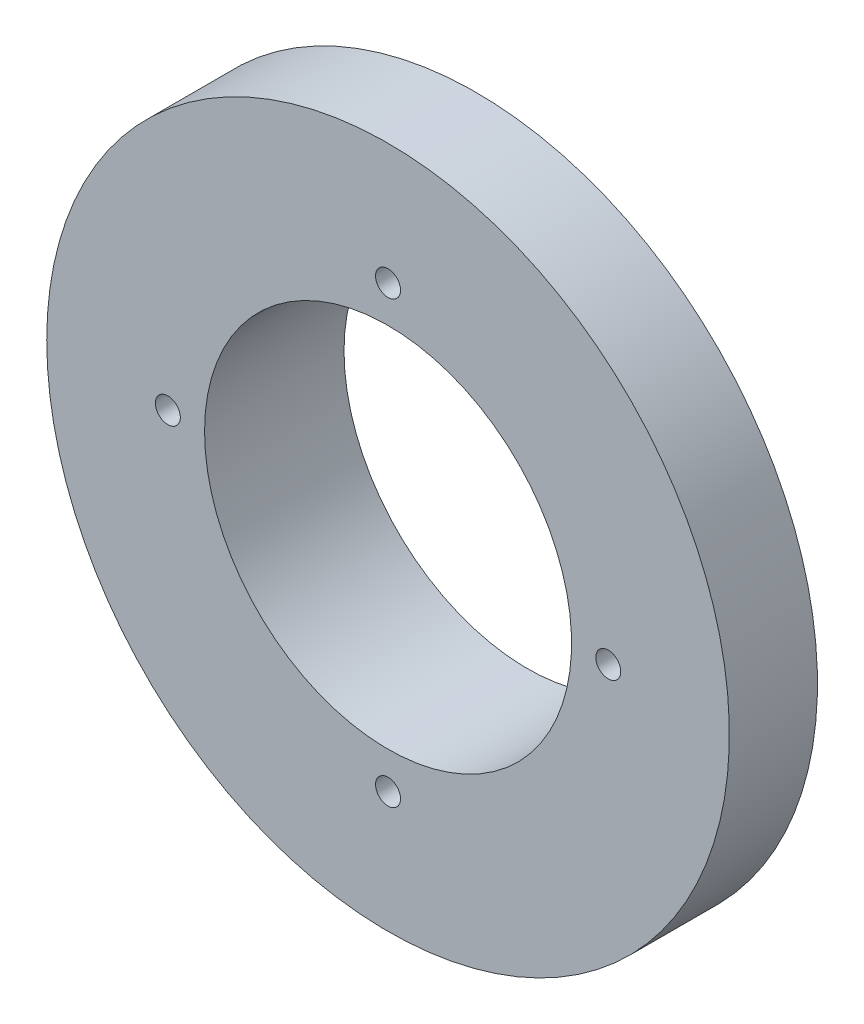
ISO-10303-21;
HEADER;
FILE_DESCRIPTION(('STEP AP214'),'2;1');
FILE_NAME('part.step','',(''),(''),'','','');
FILE_SCHEMA(('AUTOMOTIVE_DESIGN { 1 0 10303 214 1 1 1 1 }'));
ENDSEC;
DATA;
#1=APPLICATION_CONTEXT('core data for automotive mechanical design processes');
#2=APPLICATION_PROTOCOL_DEFINITION('international standard','automotive_design',2000,#1);
#3=PRODUCT_CONTEXT('',#1,'mechanical');
#4=PRODUCT('Part','Part','',(#3));
#5=PRODUCT_RELATED_PRODUCT_CATEGORY('part','',(#4));
#6=PRODUCT_DEFINITION_FORMATION('','',#4);
#7=PRODUCT_DEFINITION_CONTEXT('part definition',#1,'design');
#8=PRODUCT_DEFINITION('design','',#6,#7);
#9=PRODUCT_DEFINITION_SHAPE('','',#8);
#10=(LENGTH_UNIT() NAMED_UNIT(*) SI_UNIT(.MILLI.,.METRE.));
#11=(NAMED_UNIT(*) PLANE_ANGLE_UNIT() SI_UNIT($,.RADIAN.));
#12=(NAMED_UNIT(*) SI_UNIT($,.STERADIAN.) SOLID_ANGLE_UNIT());
#13=UNCERTAINTY_MEASURE_WITH_UNIT(LENGTH_MEASURE(1.E-05),#10,'distance_accuracy_value','');
#14=(GEOMETRIC_REPRESENTATION_CONTEXT(3) GLOBAL_UNCERTAINTY_ASSIGNED_CONTEXT((#13)) GLOBAL_UNIT_ASSIGNED_CONTEXT((#10,
#11,#12)) REPRESENTATION_CONTEXT('',''));
#15=CARTESIAN_POINT('',(0.,0.,0.));
#16=DIRECTION('',(0.,0.,1.));
#17=DIRECTION('',(1.,0.,0.));
#18=AXIS2_PLACEMENT_3D('',#15,#16,#17);
#19=CARTESIAN_POINT('',(46.5,8.32667268468867E-13,19.));
#20=DIRECTION('',(0.,0.,-0.999999999999998));
#21=DIRECTION('',(-0.999999999999999,0.,0.));
#22=AXIS2_PLACEMENT_3D('',#19,#20,#21);
#23=PLANE('',#22);
#24=CARTESIAN_POINT('',(30.,4.16333634234434E-13,19.0000000000001));
#25=DIRECTION('',(0.,0.,-0.999999999999998));
#26=DIRECTION('',(-0.999999999999999,0.,0.));
#27=AXIS2_PLACEMENT_3D('',#24,#25,#26);
#28=CIRCLE('',#27,1.7);
#29=CARTESIAN_POINT('',(31.7,1.97593805245993E-13,19.0000000000001));
#30=VERTEX_POINT('',#29);
#31=EDGE_CURVE('E78',#30,#30,#28,.T.);
#32=ORIENTED_EDGE('',*,*,#31,.T.);
#33=EDGE_LOOP('',(#32));
#34=FACE_BOUND('',#33,.T.);
#35=CARTESIAN_POINT('',(0.,-29.9999999999997,19.));
#36=DIRECTION('',(0.,0.,-0.999999999999998));
#37=DIRECTION('',(-0.999999999999999,0.,0.));
#38=AXIS2_PLACEMENT_3D('',#35,#36,#37);
#39=CIRCLE('',#38,1.7);
#40=CARTESIAN_POINT('',(1.7,-29.9999999999997,19.));
#41=VERTEX_POINT('',#40);
#42=EDGE_CURVE('E81',#41,#41,#39,.T.);
#43=ORIENTED_EDGE('',*,*,#42,.T.);
#44=EDGE_LOOP('',(#43));
#45=FACE_BOUND('',#44,.T.);
#46=CARTESIAN_POINT('',(-29.9999999999998,6.10622663543836E-13,19.0000000000003));
#47=DIRECTION('',(0.,0.,-0.999999999999998));
#48=DIRECTION('',(-0.999999999999999,0.,0.));
#49=AXIS2_PLACEMENT_3D('',#46,#47,#48);
#50=CIRCLE('',#49,1.7);
#51=CARTESIAN_POINT('',(-30.,-1.69999999999942,19.0000000000003));
#52=VERTEX_POINT('',#51);
#53=EDGE_CURVE('E85',#52,#52,#50,.T.);
#54=ORIENTED_EDGE('',*,*,#53,.T.);
#55=EDGE_LOOP('',(#54));
#56=FACE_BOUND('',#55,.T.);
#57=CARTESIAN_POINT('',(2.77555756156289E-13,30.0000000000002,19.0000000000003));
#58=DIRECTION('',(0.,0.,-0.999999999999998));
#59=DIRECTION('',(-0.999999999999999,0.,0.));
#60=AXIS2_PLACEMENT_3D('',#57,#58,#59);
#61=CIRCLE('',#60,1.7);
#62=CARTESIAN_POINT('',(1.70000000000028,30.,19.0000000000003));
#63=VERTEX_POINT('',#62);
#64=EDGE_CURVE('E70',#63,#63,#61,.T.);
#65=ORIENTED_EDGE('',*,*,#64,.T.);
#66=EDGE_LOOP('',(#65));
#67=FACE_BOUND('',#66,.T.);
#68=CARTESIAN_POINT('',(0.,3.05311331771918E-13,19.0000000000003));
#69=DIRECTION('',(0.,0.,-0.999999999999998));
#70=DIRECTION('',(-0.999999999999999,0.,0.));
#71=AXIS2_PLACEMENT_3D('',#68,#69,#70);
#72=CIRCLE('',#71,46.5);
#73=CARTESIAN_POINT('',(-46.5,2.04418216505986E-13,19.0000000000003));
#74=VERTEX_POINT('',#73);
#75=EDGE_CURVE('E66',#74,#74,#72,.T.);
#76=ORIENTED_EDGE('',*,*,#75,.F.);
#77=EDGE_LOOP('',(#76));
#78=FACE_BOUND('',#77,.T.);
#79=CARTESIAN_POINT('',(0.,3.05311331771918E-13,19.0000000000003));
#80=DIRECTION('',(0.,0.,-0.999999999999998));
#81=DIRECTION('',(-0.999999999999999,0.,0.));
#82=AXIS2_PLACEMENT_3D('',#79,#80,#81);
#83=CIRCLE('',#82,25.);
#84=CARTESIAN_POINT('',(-25.,2.24538032129512E-13,19.0000000000003));
#85=VERTEX_POINT('',#84);
#86=EDGE_CURVE('E10',#85,#85,#83,.T.);
#87=ORIENTED_EDGE('',*,*,#86,.T.);
#88=EDGE_LOOP('',(#87));
#89=FACE_BOUND('',#88,.T.);
#90=ADVANCED_FACE('F36',(#34,#45,#56,#67,#78,#89),#23,.F.);
#91=CARTESIAN_POINT('',(0.,2.4980018054066E-13,-25.8441781222));
#92=DIRECTION('',(0.,0.,-0.999999999999998));
#93=DIRECTION('',(-0.999999999999999,0.,0.));
#94=AXIS2_PLACEMENT_3D('',#91,#92,#93);
#95=CYLINDRICAL_SURFACE('',#94,25.);
#96=CARTESIAN_POINT('',(0.,0.,0.));
#97=DIRECTION('',(0.,0.,-0.999999999999998));
#98=DIRECTION('',(-0.999999999999999,0.,0.));
#99=AXIS2_PLACEMENT_3D('',#96,#97,#98);
#100=CIRCLE('',#99,25.);
#101=CARTESIAN_POINT('',(-25.,2.25329066034558E-13,0.));
#102=VERTEX_POINT('',#101);
#103=EDGE_CURVE('E43',#102,#102,#100,.T.);
#104=CARTESIAN_POINT('',(-25.,2.24538032129512E-13,19.0000000000003));
#105=CARTESIAN_POINT('',(-25.,2.24546272066023E-13,18.8020833333336));
#106=CARTESIAN_POINT('',(-25.,2.24554512002534E-13,18.604166666667));
#107=CARTESIAN_POINT('',(-25.,2.24570991875556E-13,18.2083333333336));
#108=CARTESIAN_POINT('',(-25.,2.24579231812067E-13,18.0104166666669));
#109=CARTESIAN_POINT('',(-25.,2.24595711685089E-13,17.6145833333336));
#110=CARTESIAN_POINT('',(-25.,2.246039516216E-13,17.4166666666669));
#111=CARTESIAN_POINT('',(-25.,2.24620431494621E-13,17.0208333333336));
#112=CARTESIAN_POINT('',(-25.,2.24628671431132E-13,16.8229166666669));
#113=CARTESIAN_POINT('',(-25.,2.24645151304154E-13,16.4270833333336));
#114=CARTESIAN_POINT('',(-25.,2.24653391240665E-13,16.2291666666669));
#115=CARTESIAN_POINT('',(-25.,2.24669871113687E-13,15.8333333333336));
#116=CARTESIAN_POINT('',(-25.,2.24678111050198E-13,15.6354166666669));
#117=CARTESIAN_POINT('',(-25.,2.24694590923219E-13,15.2395833333336));
#118=CARTESIAN_POINT('',(-25.,2.2470283085973E-13,15.0416666666669));
#119=CARTESIAN_POINT('',(-25.,2.24719310732752E-13,14.6458333333336));
#120=CARTESIAN_POINT('',(-25.,2.24727550669263E-13,14.4479166666669));
#121=CARTESIAN_POINT('',(-25.,2.24744030542285E-13,14.0520833333336));
#122=CARTESIAN_POINT('',(-25.,2.24752270478796E-13,13.8541666666669));
#123=CARTESIAN_POINT('',(-25.,2.24768750351817E-13,13.4583333333335));
#124=CARTESIAN_POINT('',(-25.,2.24776990288328E-13,13.2604166666669));
#125=CARTESIAN_POINT('',(-25.,2.2479347016135E-13,12.8645833333335));
#126=CARTESIAN_POINT('',(-25.,2.24801710097861E-13,12.6666666666669));
#127=CARTESIAN_POINT('',(-25.,2.24818189970883E-13,12.2708333333335));
#128=CARTESIAN_POINT('',(-25.,2.24826429907394E-13,12.0729166666669));
#129=CARTESIAN_POINT('',(-25.,2.24842909780415E-13,11.6770833333335));
#130=CARTESIAN_POINT('',(-25.,2.24851149716926E-13,11.4791666666668));
#131=CARTESIAN_POINT('',(-25.,2.24867629589948E-13,11.0833333333335));
#132=CARTESIAN_POINT('',(-25.,2.24875869526459E-13,10.8854166666668));
#133=CARTESIAN_POINT('',(-25.,2.24892349399481E-13,10.4895833333335));
#134=CARTESIAN_POINT('',(-25.,2.24900589335992E-13,10.2916666666668));
#135=CARTESIAN_POINT('',(-25.,2.24917069209013E-13,9.89583333333349));
#136=CARTESIAN_POINT('',(-25.,2.24925309145524E-13,9.69791666666682));
#137=CARTESIAN_POINT('',(-25.,2.24941789018546E-13,9.30208333333348));
#138=CARTESIAN_POINT('',(-25.,2.24950028955057E-13,9.10416666666681));
#139=CARTESIAN_POINT('',(-25.,2.24966508828079E-13,8.70833333333347));
#140=CARTESIAN_POINT('',(-25.,2.2497474876459E-13,8.5104166666668));
#141=CARTESIAN_POINT('',(-25.,2.24991228637611E-13,8.11458333333347));
#142=CARTESIAN_POINT('',(-25.,2.24999468574122E-13,7.9166666666668));
#143=CARTESIAN_POINT('',(-25.,2.25015948447144E-13,7.52083333333345));
#144=CARTESIAN_POINT('',(-25.,2.25024188383655E-13,7.32291666666678));
#145=CARTESIAN_POINT('',(-25.,2.25040668256677E-13,6.92708333333345));
#146=CARTESIAN_POINT('',(-25.,2.25048908193188E-13,6.72916666666678));
#147=CARTESIAN_POINT('',(-25.,2.25065388066209E-13,6.33333333333344));
#148=CARTESIAN_POINT('',(-25.,2.2507362800272E-13,6.13541666666677));
#149=CARTESIAN_POINT('',(-25.,2.25090107875742E-13,5.73958333333343));
#150=CARTESIAN_POINT('',(-25.,2.25098347812253E-13,5.54166666666676));
#151=CARTESIAN_POINT('',(-25.,2.25114827685275E-13,5.14583333333342));
#152=CARTESIAN_POINT('',(-25.,2.25123067621786E-13,4.94791666666675));
#153=CARTESIAN_POINT('',(-25.,2.25139547494807E-13,4.55208333333341));
#154=CARTESIAN_POINT('',(-25.,2.25147787431318E-13,4.35416666666674));
#155=CARTESIAN_POINT('',(-25.,2.2516426730434E-13,3.9583333333334));
#156=CARTESIAN_POINT('',(-25.,2.25172507240851E-13,3.76041666666673));
#157=CARTESIAN_POINT('',(-25.,2.25188987113873E-13,3.36458333333339));
#158=CARTESIAN_POINT('',(-25.,2.25197227050384E-13,3.16666666666672));
#159=CARTESIAN_POINT('',(-25.,2.25213706923405E-13,2.77083333333338));
#160=CARTESIAN_POINT('',(-25.,2.25221946859916E-13,2.57291666666671));
#161=CARTESIAN_POINT('',(-25.,2.25238426732938E-13,2.17708333333337));
#162=CARTESIAN_POINT('',(-25.,2.25246666669449E-13,1.9791666666667));
#163=CARTESIAN_POINT('',(-25.,2.25263146542471E-13,1.58333333333336));
#164=CARTESIAN_POINT('',(-25.,2.25271386478982E-13,1.3854166666667));
#165=CARTESIAN_POINT('',(-25.,2.25287866352003E-13,0.989583333333358));
#166=CARTESIAN_POINT('',(-25.,2.25296106288514E-13,0.791666666666688));
#167=CARTESIAN_POINT('',(-25.,2.25312586161536E-13,0.395833333333348));
#168=CARTESIAN_POINT('',(-25.,2.25320826098047E-13,0.197916666666677));
#169=CARTESIAN_POINT('',(-25.,2.25329066034558E-13,0.));
#170=B_SPLINE_CURVE_WITH_KNOTS('',3,(#104,#105,#106,#107,#108,#109,#110,#111,#112,#113,#114,
#115,#116,#117,#118,#119,#120,#121,#122,#123,#124,#125,#126,#127,#128,#129,#130,#131,#132,#133,
#134,#135,#136,#137,#138,#139,#140,#141,#142,#143,#144,#145,#146,#147,#148,#149,#150,#151,#152,
#153,#154,#155,#156,#157,#158,#159,#160,#161,#162,#163,#164,#165,#166,#167,#168,#169),
.UNSPECIFIED.,.F.,.F.,(4,2,2,2,2,2,2,2,2,2,2,2,2,2,2,2,2,2,2,2,2,2,2,2,2,2,2,2,2,2,2,2,4),(0.,
0.593750000000011,1.18750000000002,1.78125000000003,2.37500000000004,2.96875000000004,
3.56250000000005,4.15625000000006,4.75000000000007,5.34375000000008,5.93750000000009,
6.5312500000001,7.12500000000011,7.71875000000012,8.31250000000013,8.90625000000014,
9.50000000000014,10.0937500000002,10.6875000000002,11.2812500000002,11.8750000000002,
12.4687500000002,13.0625000000002,13.6562500000002,14.2500000000002,14.8437500000002,
15.4375000000002,16.0312500000002,16.6250000000003,17.2187500000003,17.8125000000003,
18.4062500000003,19.0000000000003),.UNSPECIFIED.);
#171=EDGE_CURVE('BSEAM115',#85,#102,#170,.T.);
#172=ORIENTED_EDGE('',*,*,#86,.F.);
#173=ORIENTED_EDGE('',*,*,#103,.T.);
#174=ORIENTED_EDGE('',*,*,#171,.T.);
#175=ORIENTED_EDGE('',*,*,#171,.F.);
#176=EDGE_LOOP('',(#172,#174,#173,#175));
#177=FACE_BOUND('',#176,.T.);
#178=ADVANCED_FACE('F115',(#177),#95,.F.);
#179=CARTESIAN_POINT('',(25.,2.4980018054066E-13,0.));
#180=DIRECTION('',(0.,0.,0.999999999999998));
#181=DIRECTION('',(0.999999999999999,0.,0.));
#182=AXIS2_PLACEMENT_3D('',#179,#180,#181);
#183=PLANE('',#182);
#184=CARTESIAN_POINT('',(30.,1.94289029309402E-13,2.77555756156289E-13));
#185=DIRECTION('',(0.,0.,0.999999999999998));
#186=DIRECTION('',(0.,-0.999999999999997,0.));
#187=AXIS2_PLACEMENT_3D('',#184,#185,#186);
#188=CIRCLE('',#187,1.7);
#189=CARTESIAN_POINT('',(31.7,1.95879898451728E-13,2.77304361691256E-13));
#190=VERTEX_POINT('',#189);
#191=EDGE_CURVE('E89',#190,#190,#188,.T.);
#192=ORIENTED_EDGE('',*,*,#191,.T.);
#193=EDGE_LOOP('',(#192));
#194=FACE_BOUND('',#193,.T.);
#195=CARTESIAN_POINT('',(0.,-29.9999999999997,4.44089209850063E-13));
#196=DIRECTION('',(0.,0.,0.999999999999998));
#197=DIRECTION('',(-0.999999999999999,0.,0.));
#198=AXIS2_PLACEMENT_3D('',#195,#196,#197);
#199=CIRCLE('',#198,1.7);
#200=CARTESIAN_POINT('',(1.7,-29.9999999999997,4.4361368899983E-13));
#201=VERTEX_POINT('',#200);
#202=EDGE_CURVE('E94',#201,#201,#199,.T.);
#203=ORIENTED_EDGE('',*,*,#202,.T.);
#204=EDGE_LOOP('',(#203));
#205=FACE_BOUND('',#204,.T.);
#206=CARTESIAN_POINT('',(-30.,5.82867087928207E-13,0.));
#207=DIRECTION('',(0.,0.,0.999999999999998));
#208=DIRECTION('',(0.,0.999999999999997,0.));
#209=AXIS2_PLACEMENT_3D('',#206,#207,#208);
#210=CIRCLE('',#209,1.7);
#211=CARTESIAN_POINT('',(-30.,-1.69999999999941,0.));
#212=VERTEX_POINT('',#211);
#213=EDGE_CURVE('E90',#212,#212,#210,.T.);
#214=ORIENTED_EDGE('',*,*,#213,.T.);
#215=EDGE_LOOP('',(#214));
#216=FACE_BOUND('',#215,.T.);
#217=CARTESIAN_POINT('',(2.77555756156289E-13,30.,0.));
#218=DIRECTION('',(0.,0.,0.999999999999998));
#219=DIRECTION('',(0.999999999999999,0.,0.));
#220=AXIS2_PLACEMENT_3D('',#217,#218,#219);
#221=CIRCLE('',#220,1.7);
#222=CARTESIAN_POINT('',(1.70000000000028,30.,0.));
#223=VERTEX_POINT('',#222);
#224=EDGE_CURVE('E74',#223,#223,#221,.T.);
#225=ORIENTED_EDGE('',*,*,#224,.T.);
#226=EDGE_LOOP('',(#225));
#227=FACE_BOUND('',#226,.T.);
#228=ORIENTED_EDGE('',*,*,#103,.F.);
#229=EDGE_LOOP('',(#228));
#230=FACE_BOUND('',#229,.T.);
#231=CARTESIAN_POINT('',(0.,0.,0.));
#232=DIRECTION('',(0.,0.,-0.999999999999998));
#233=DIRECTION('',(-0.999999999999999,0.,0.));
#234=AXIS2_PLACEMENT_3D('',#231,#232,#233);
#235=CIRCLE('',#234,35.);
#236=CARTESIAN_POINT('',(-35.,2.15971012256174E-13,0.));
#237=VERTEX_POINT('',#236);
#238=EDGE_CURVE('E50',#237,#237,#235,.T.);
#239=ORIENTED_EDGE('',*,*,#238,.T.);
#240=EDGE_LOOP('',(#239));
#241=FACE_BOUND('',#240,.T.);
#242=ADVANCED_FACE('F103',(#194,#205,#216,#227,#230,#241),#183,.F.);
#243=CARTESIAN_POINT('',(0.,2.4980018054066E-13,-25.8441781222));
#244=DIRECTION('',(0.,0.,-0.999999999999998));
#245=DIRECTION('',(-0.999999999999999,0.,0.));
#246=AXIS2_PLACEMENT_3D('',#243,#244,#245);
#247=CYLINDRICAL_SURFACE('',#246,35.);
#248=CARTESIAN_POINT('',(0.,0.,7.00000000000028));
#249=DIRECTION('',(0.,0.,-0.999999999999998));
#250=DIRECTION('',(-0.999999999999999,0.,0.));
#251=AXIS2_PLACEMENT_3D('',#248,#249,#250);
#252=CIRCLE('',#251,35.);
#253=CARTESIAN_POINT('',(-35.,2.1567957871221E-13,7.00000000000029));
#254=VERTEX_POINT('',#253);
#255=EDGE_CURVE('E56',#254,#254,#252,.T.);
#256=CARTESIAN_POINT('',(-35.,2.15971012256174E-13,0.));
#257=CARTESIAN_POINT('',(-35.,2.15967976490091E-13,0.0729166666666771));
#258=CARTESIAN_POINT('',(-35.,2.15964940724008E-13,0.145833333333347));
#259=CARTESIAN_POINT('',(-35.,2.15958869191842E-13,0.291666666666687));
#260=CARTESIAN_POINT('',(-35.,2.15955833425759E-13,0.364583333333356));
#261=CARTESIAN_POINT('',(-35.,2.15949761893593E-13,0.510416666666695));
#262=CARTESIAN_POINT('',(-35.,2.1594672612751E-13,0.583333333333365));
#263=CARTESIAN_POINT('',(-35.,2.15940654595344E-13,0.729166666666705));
#264=CARTESIAN_POINT('',(-35.,2.15937618829261E-13,0.802083333333376));
#265=CARTESIAN_POINT('',(-35.,2.15931547297095E-13,0.947916666666715));
#266=CARTESIAN_POINT('',(-35.,2.15928511531012E-13,1.02083333333338));
#267=CARTESIAN_POINT('',(-35.,2.15922439998846E-13,1.16666666666672));
#268=CARTESIAN_POINT('',(-35.,2.15919404232763E-13,1.23958333333339));
#269=CARTESIAN_POINT('',(-35.,2.15913332700597E-13,1.38541666666673));
#270=CARTESIAN_POINT('',(-35.,2.15910296934514E-13,1.4583333333334));
#271=CARTESIAN_POINT('',(-35.,2.15904225402349E-13,1.60416666666674));
#272=CARTESIAN_POINT('',(-35.,2.15901189636266E-13,1.67708333333341));
#273=CARTESIAN_POINT('',(-35.,2.158951181041E-13,1.82291666666675));
#274=CARTESIAN_POINT('',(-35.,2.15892082338017E-13,1.89583333333342));
#275=CARTESIAN_POINT('',(-35.,2.15886010805851E-13,2.04166666666676));
#276=CARTESIAN_POINT('',(-35.,2.15882975039768E-13,2.11458333333343));
#277=CARTESIAN_POINT('',(-35.,2.15876903507602E-13,2.26041666666677));
#278=CARTESIAN_POINT('',(-35.,2.15873867741519E-13,2.33333333333344));
#279=CARTESIAN_POINT('',(-35.,2.15867796209353E-13,2.47916666666678));
#280=CARTESIAN_POINT('',(-35.,2.1586476044327E-13,2.55208333333345));
#281=CARTESIAN_POINT('',(-35.,2.15858688911104E-13,2.69791666666679));
#282=CARTESIAN_POINT('',(-35.,2.15855653145021E-13,2.77083333333346));
#283=CARTESIAN_POINT('',(-35.,2.15849581612855E-13,2.9166666666668));
#284=CARTESIAN_POINT('',(-35.,2.15846545846772E-13,2.98958333333347));
#285=CARTESIAN_POINT('',(-35.,2.15840474314606E-13,3.1354166666668));
#286=CARTESIAN_POINT('',(-35.,2.15837438548523E-13,3.20833333333347));
#287=CARTESIAN_POINT('',(-35.,2.15831367016358E-13,3.35416666666681));
#288=CARTESIAN_POINT('',(-35.,2.15828331250275E-13,3.42708333333348));
#289=CARTESIAN_POINT('',(-35.,2.15822259718109E-13,3.57291666666682));
#290=CARTESIAN_POINT('',(-35.,2.15819223952026E-13,3.64583333333349));
#291=CARTESIAN_POINT('',(-35.,2.1581315241986E-13,3.79166666666683));
#292=CARTESIAN_POINT('',(-35.,2.15810116653777E-13,3.8645833333335));
#293=CARTESIAN_POINT('',(-35.,2.15804045121611E-13,4.01041666666684));
#294=CARTESIAN_POINT('',(-35.,2.15801009355528E-13,4.08333333333351));
#295=CARTESIAN_POINT('',(-35.,2.15794937823362E-13,4.22916666666685));
#296=CARTESIAN_POINT('',(-35.,2.15791902057279E-13,4.30208333333352));
#297=CARTESIAN_POINT('',(-35.,2.15785830525113E-13,4.44791666666686));
#298=CARTESIAN_POINT('',(-35.,2.1578279475903E-13,4.52083333333353));
#299=CARTESIAN_POINT('',(-35.,2.15776723226864E-13,4.66666666666687));
#300=CARTESIAN_POINT('',(-35.,2.15773687460781E-13,4.73958333333354));
#301=CARTESIAN_POINT('',(-35.,2.15767615928615E-13,4.88541666666688));
#302=CARTESIAN_POINT('',(-35.,2.15764580162532E-13,4.95833333333355));
#303=CARTESIAN_POINT('',(-35.,2.15758508630366E-13,5.10416666666689));
#304=CARTESIAN_POINT('',(-35.,2.15755472864284E-13,5.17708333333355));
#305=CARTESIAN_POINT('',(-35.,2.15749401332118E-13,5.32291666666689));
#306=CARTESIAN_POINT('',(-35.,2.15746365566035E-13,5.39583333333356));
#307=CARTESIAN_POINT('',(-35.,2.15740294033869E-13,5.5416666666669));
#308=CARTESIAN_POINT('',(-35.,2.15737258267786E-13,5.61458333333357));
#309=CARTESIAN_POINT('',(-35.,2.1573118673562E-13,5.76041666666691));
#310=CARTESIAN_POINT('',(-35.,2.15728150969537E-13,5.83333333333359));
#311=CARTESIAN_POINT('',(-35.,2.15722079437371E-13,5.97916666666692));
#312=CARTESIAN_POINT('',(-35.,2.15719043671288E-13,6.0520833333336));
#313=CARTESIAN_POINT('',(-35.,2.15712972139122E-13,6.19791666666694));
#314=CARTESIAN_POINT('',(-35.,2.15709936373039E-13,6.27083333333361));
#315=CARTESIAN_POINT('',(-35.,2.15703864840873E-13,6.41666666666694));
#316=CARTESIAN_POINT('',(-35.,2.1570082907479E-13,6.48958333333361));
#317=CARTESIAN_POINT('',(-35.,2.15694757542624E-13,6.63541666666695));
#318=CARTESIAN_POINT('',(-35.,2.15691721776541E-13,6.70833333333362));
#319=CARTESIAN_POINT('',(-35.,2.15685650244375E-13,6.85416666666696));
#320=CARTESIAN_POINT('',(-35.,2.15682614478292E-13,6.92708333333363));
#321=CARTESIAN_POINT('',(-35.,2.1567957871221E-13,7.00000000000029));
#322=B_SPLINE_CURVE_WITH_KNOTS('',3,(#256,#257,#258,#259,#260,#261,#262,#263,#264,#265,#266,
#267,#268,#269,#270,#271,#272,#273,#274,#275,#276,#277,#278,#279,#280,#281,#282,#283,#284,#285,
#286,#287,#288,#289,#290,#291,#292,#293,#294,#295,#296,#297,#298,#299,#300,#301,#302,#303,#304,
#305,#306,#307,#308,#309,#310,#311,#312,#313,#314,#315,#316,#317,#318,#319,#320,#321),
.UNSPECIFIED.,.F.,.F.,(4,2,2,2,2,2,2,2,2,2,2,2,2,2,2,2,2,2,2,2,2,2,2,2,2,2,2,2,2,2,2,2,4),(0.,
0.218750000000011,0.437500000000018,0.656250000000028,0.875000000000039,1.09375000000005,
1.31250000000006,1.53125000000006,1.75000000000007,1.96875000000008,2.18750000000009,
2.4062500000001,2.62500000000011,2.84375000000012,3.06250000000013,3.28125000000013,
3.50000000000015,3.71875000000016,3.93750000000016,4.15625000000017,4.37500000000018,
4.59375000000019,4.8125000000002,5.03125000000021,5.25000000000022,5.46875000000023,
5.68750000000024,5.90625000000025,6.12500000000026,6.34375000000027,6.56250000000027,
6.78125000000028,7.00000000000029),.UNSPECIFIED.);
#323=EDGE_CURVE('BSEAM137',#237,#254,#322,.T.);
#324=ORIENTED_EDGE('',*,*,#238,.F.);
#325=ORIENTED_EDGE('',*,*,#255,.T.);
#326=ORIENTED_EDGE('',*,*,#323,.T.);
#327=ORIENTED_EDGE('',*,*,#323,.F.);
#328=EDGE_LOOP('',(#324,#326,#325,#327));
#329=FACE_BOUND('',#328,.T.);
#330=ADVANCED_FACE('F137',(#329),#247,.T.);
#331=CARTESIAN_POINT('',(35.,3.05311331771918E-13,7.00000000000001));
#332=DIRECTION('',(0.,0.,0.999999999999998));
#333=DIRECTION('',(0.999999999999999,0.,0.));
#334=AXIS2_PLACEMENT_3D('',#331,#332,#333);
#335=PLANE('',#334);
#336=ORIENTED_EDGE('',*,*,#255,.F.);
#337=EDGE_LOOP('',(#336));
#338=FACE_BOUND('',#337,.T.);
#339=CARTESIAN_POINT('',(0.,0.,7.00000000000028));
#340=DIRECTION('',(0.,0.,-0.999999999999998));
#341=DIRECTION('',(-0.999999999999999,0.,0.));
#342=AXIS2_PLACEMENT_3D('',#339,#340,#341);
#343=CIRCLE('',#342,46.5);
#344=CARTESIAN_POINT('',(-46.5,2.04917816867068E-13,7.00000000000028));
#345=VERTEX_POINT('',#344);
#346=EDGE_CURVE('E62',#345,#345,#343,.T.);
#347=ORIENTED_EDGE('',*,*,#346,.T.);
#348=EDGE_LOOP('',(#347));
#349=FACE_BOUND('',#348,.T.);
#350=ADVANCED_FACE('F127',(#338,#349),#335,.F.);
#351=CARTESIAN_POINT('',(0.,2.4980018054066E-13,-25.8441781222));
#352=DIRECTION('',(0.,0.,-0.999999999999998));
#353=DIRECTION('',(-0.999999999999999,0.,0.));
#354=AXIS2_PLACEMENT_3D('',#351,#352,#353);
#355=CYLINDRICAL_SURFACE('',#354,46.5);
#356=CARTESIAN_POINT('',(-46.5,2.04917816867068E-13,7.00000000000028));
#357=CARTESIAN_POINT('',(-46.5,2.0491261269664E-13,7.12500000000028));
#358=CARTESIAN_POINT('',(-46.5,2.04907408526212E-13,7.25000000000028));
#359=CARTESIAN_POINT('',(-46.5,2.04897000185356E-13,7.50000000000028));
#360=CARTESIAN_POINT('',(-46.5,2.04891796014928E-13,7.62500000000028));
#361=CARTESIAN_POINT('',(-46.5,2.04881387674072E-13,7.87500000000028));
#362=CARTESIAN_POINT('',(-46.5,2.04876183503644E-13,8.00000000000028));
#363=CARTESIAN_POINT('',(-46.5,2.04865775162788E-13,8.25000000000028));
#364=CARTESIAN_POINT('',(-46.5,2.0486057099236E-13,8.37500000000028));
#365=CARTESIAN_POINT('',(-46.5,2.04850162651505E-13,8.62500000000029));
#366=CARTESIAN_POINT('',(-46.5,2.04844958481077E-13,8.75000000000029));
#367=CARTESIAN_POINT('',(-46.5,2.04834550140221E-13,9.00000000000029));
#368=CARTESIAN_POINT('',(-46.5,2.04829345969793E-13,9.12500000000029));
#369=CARTESIAN_POINT('',(-46.5,2.04818937628937E-13,9.37500000000029));
#370=CARTESIAN_POINT('',(-46.5,2.04813733458509E-13,9.50000000000029));
#371=CARTESIAN_POINT('',(-46.5,2.04803325117653E-13,9.75000000000029));
#372=CARTESIAN_POINT('',(-46.5,2.04798120947225E-13,9.87500000000029));
#373=CARTESIAN_POINT('',(-46.5,2.04787712606369E-13,10.1250000000003));
#374=CARTESIAN_POINT('',(-46.5,2.04782508435941E-13,10.2500000000003));
#375=CARTESIAN_POINT('',(-46.5,2.04772100095086E-13,10.5000000000003));
#376=CARTESIAN_POINT('',(-46.5,2.04766895924658E-13,10.6250000000003));
#377=CARTESIAN_POINT('',(-46.5,2.04756487583802E-13,10.8750000000003));
#378=CARTESIAN_POINT('',(-46.5,2.04751283413374E-13,11.0000000000003));
#379=CARTESIAN_POINT('',(-46.5,2.04740875072518E-13,11.2500000000003));
#380=CARTESIAN_POINT('',(-46.5,2.0473567090209E-13,11.3750000000003));
#381=CARTESIAN_POINT('',(-46.5,2.04725262561234E-13,11.6250000000003));
#382=CARTESIAN_POINT('',(-46.5,2.04720058390806E-13,11.7500000000003));
#383=CARTESIAN_POINT('',(-46.5,2.0470965004995E-13,12.0000000000003));
#384=CARTESIAN_POINT('',(-46.5,2.04704445879523E-13,12.1250000000003));
#385=CARTESIAN_POINT('',(-46.5,2.04694037538667E-13,12.3750000000003));
#386=CARTESIAN_POINT('',(-46.5,2.04688833368239E-13,12.5000000000003));
#387=CARTESIAN_POINT('',(-46.5,2.04678425027383E-13,12.7500000000003));
#388=CARTESIAN_POINT('',(-46.5,2.04673220856955E-13,12.8750000000003));
#389=CARTESIAN_POINT('',(-46.5,2.04662812516099E-13,13.1250000000003));
#390=CARTESIAN_POINT('',(-46.5,2.04657608345671E-13,13.2500000000003));
#391=CARTESIAN_POINT('',(-46.5,2.04647200004815E-13,13.5000000000003));
#392=CARTESIAN_POINT('',(-46.5,2.04641995834387E-13,13.6250000000003));
#393=CARTESIAN_POINT('',(-46.5,2.04631587493532E-13,13.8750000000003));
#394=CARTESIAN_POINT('',(-46.5,2.04626383323104E-13,14.0000000000003));
#395=CARTESIAN_POINT('',(-46.5,2.04615974982248E-13,14.2500000000003));
#396=CARTESIAN_POINT('',(-46.5,2.0461077081182E-13,14.3750000000003));
#397=CARTESIAN_POINT('',(-46.5,2.04600362470964E-13,14.6250000000003));
#398=CARTESIAN_POINT('',(-46.5,2.04595158300536E-13,14.7500000000003));
#399=CARTESIAN_POINT('',(-46.5,2.0458474995968E-13,15.0000000000003));
#400=CARTESIAN_POINT('',(-46.5,2.04579545789252E-13,15.1250000000003));
#401=CARTESIAN_POINT('',(-46.5,2.04569137448396E-13,15.3750000000003));
#402=CARTESIAN_POINT('',(-46.5,2.04563933277968E-13,15.5000000000003));
#403=CARTESIAN_POINT('',(-46.5,2.04553524937113E-13,15.7500000000003));
#404=CARTESIAN_POINT('',(-46.5,2.04548320766685E-13,15.8750000000003));
#405=CARTESIAN_POINT('',(-46.5,2.04537912425829E-13,16.1250000000003));
#406=CARTESIAN_POINT('',(-46.5,2.04532708255401E-13,16.2500000000003));
#407=CARTESIAN_POINT('',(-46.5,2.04522299914545E-13,16.5000000000003));
#408=CARTESIAN_POINT('',(-46.5,2.04517095744117E-13,16.6250000000003));
#409=CARTESIAN_POINT('',(-46.5,2.04506687403261E-13,16.8750000000003));
#410=CARTESIAN_POINT('',(-46.5,2.04501483232833E-13,17.0000000000003));
#411=CARTESIAN_POINT('',(-46.5,2.04491074891977E-13,17.2500000000003));
#412=CARTESIAN_POINT('',(-46.5,2.04485870721549E-13,17.3750000000003));
#413=CARTESIAN_POINT('',(-46.5,2.04475462380694E-13,17.6250000000003));
#414=CARTESIAN_POINT('',(-46.5,2.04470258210266E-13,17.7500000000003));
#415=CARTESIAN_POINT('',(-46.5,2.0445984986941E-13,18.0000000000003));
#416=CARTESIAN_POINT('',(-46.5,2.04454645698982E-13,18.1250000000003));
#417=CARTESIAN_POINT('',(-46.5,2.04444237358126E-13,18.3750000000003));
#418=CARTESIAN_POINT('',(-46.5,2.04439033187698E-13,18.5000000000003));
#419=CARTESIAN_POINT('',(-46.5,2.04428624846842E-13,18.7500000000003));
#420=CARTESIAN_POINT('',(-46.5,2.04423420676414E-13,18.8750000000003));
#421=CARTESIAN_POINT('',(-46.5,2.04418216505986E-13,19.0000000000003));
#422=B_SPLINE_CURVE_WITH_KNOTS('',3,(#356,#357,#358,#359,#360,#361,#362,#363,#364,#365,#366,
#367,#368,#369,#370,#371,#372,#373,#374,#375,#376,#377,#378,#379,#380,#381,#382,#383,#384,#385,
#386,#387,#388,#389,#390,#391,#392,#393,#394,#395,#396,#397,#398,#399,#400,#401,#402,#403,#404,
#405,#406,#407,#408,#409,#410,#411,#412,#413,#414,#415,#416,#417,#418,#419,#420,#421),
.UNSPECIFIED.,.F.,.F.,(4,2,2,2,2,2,2,2,2,2,2,2,2,2,2,2,2,2,2,2,2,2,2,2,2,2,2,2,2,2,2,2,4),(0.,
0.375,0.750000000000001,1.125,1.5,1.87500000000001,2.25000000000001,2.62500000000001,
3.00000000000001,3.375,3.75,4.125,4.50000000000001,4.87500000000001,5.25000000000001,
5.62500000000001,6.00000000000001,6.37500000000001,6.75000000000001,7.12500000000001,
7.50000000000001,7.87500000000001,8.25000000000001,8.62500000000001,9.00000000000001,
9.37500000000001,9.75000000000001,10.125,10.5,10.875,11.25,11.625,12.),.UNSPECIFIED.);
#423=EDGE_CURVE('BSEAM124',#345,#74,#422,.T.);
#424=ORIENTED_EDGE('',*,*,#346,.F.);
#425=ORIENTED_EDGE('',*,*,#75,.T.);
#426=ORIENTED_EDGE('',*,*,#423,.T.);
#427=ORIENTED_EDGE('',*,*,#423,.F.);
#428=EDGE_LOOP('',(#424,#426,#425,#427));
#429=FACE_BOUND('',#428,.T.);
#430=ADVANCED_FACE('F124',(#429),#355,.T.);
#431=CARTESIAN_POINT('',(2.77555756156289E-13,30.,0.));
#432=DIRECTION('',(0.,0.,0.999999999999998));
#433=DIRECTION('',(0.999999999999999,0.,0.));
#434=AXIS2_PLACEMENT_3D('',#431,#432,#433);
#435=CYLINDRICAL_SURFACE('',#434,1.7);
#436=CARTESIAN_POINT('',(1.70000000000028,30.,0.));
#437=CARTESIAN_POINT('',(1.70000000000028,30.,0.19791666666667));
#438=CARTESIAN_POINT('',(1.70000000000028,30.,0.395833333333339));
#439=CARTESIAN_POINT('',(1.70000000000028,30.,0.791666666666679));
#440=CARTESIAN_POINT('',(1.70000000000028,30.,0.989583333333349));
#441=CARTESIAN_POINT('',(1.70000000000028,30.,1.38541666666669));
#442=CARTESIAN_POINT('',(1.70000000000028,30.,1.58333333333336));
#443=CARTESIAN_POINT('',(1.70000000000028,30.,1.9791666666667));
#444=CARTESIAN_POINT('',(1.70000000000028,30.,2.17708333333337));
#445=CARTESIAN_POINT('',(1.70000000000028,30.,2.57291666666671));
#446=CARTESIAN_POINT('',(1.70000000000028,30.,2.77083333333338));
#447=CARTESIAN_POINT('',(1.70000000000028,30.,3.16666666666672));
#448=CARTESIAN_POINT('',(1.70000000000028,30.,3.36458333333339));
#449=CARTESIAN_POINT('',(1.70000000000028,30.,3.76041666666672));
#450=CARTESIAN_POINT('',(1.70000000000028,30.,3.95833333333339));
#451=CARTESIAN_POINT('',(1.70000000000028,30.,4.35416666666673));
#452=CARTESIAN_POINT('',(1.70000000000028,30.,4.5520833333334));
#453=CARTESIAN_POINT('',(1.70000000000028,30.,4.94791666666674));
#454=CARTESIAN_POINT('',(1.70000000000028,30.,5.14583333333341));
#455=CARTESIAN_POINT('',(1.70000000000028,30.,5.54166666666675));
#456=CARTESIAN_POINT('',(1.70000000000028,30.,5.73958333333342));
#457=CARTESIAN_POINT('',(1.70000000000028,30.,6.13541666666676));
#458=CARTESIAN_POINT('',(1.70000000000028,30.,6.33333333333343));
#459=CARTESIAN_POINT('',(1.70000000000028,30.,6.72916666666677));
#460=CARTESIAN_POINT('',(1.70000000000028,30.,6.92708333333344));
#461=CARTESIAN_POINT('',(1.70000000000028,30.,7.32291666666678));
#462=CARTESIAN_POINT('',(1.70000000000028,30.,7.52083333333345));
#463=CARTESIAN_POINT('',(1.70000000000028,30.,7.91666666666679));
#464=CARTESIAN_POINT('',(1.70000000000028,30.,8.11458333333346));
#465=CARTESIAN_POINT('',(1.70000000000028,30.,8.5104166666668));
#466=CARTESIAN_POINT('',(1.70000000000028,30.,8.70833333333347));
#467=CARTESIAN_POINT('',(1.70000000000028,30.,9.10416666666681));
#468=CARTESIAN_POINT('',(1.70000000000028,30.,9.30208333333348));
#469=CARTESIAN_POINT('',(1.70000000000028,30.,9.69791666666682));
#470=CARTESIAN_POINT('',(1.70000000000028,30.,9.89583333333349));
#471=CARTESIAN_POINT('',(1.70000000000028,30.,10.2916666666668));
#472=CARTESIAN_POINT('',(1.70000000000028,30.,10.4895833333335));
#473=CARTESIAN_POINT('',(1.70000000000028,30.,10.8854166666668));
#474=CARTESIAN_POINT('',(1.70000000000028,30.,11.0833333333335));
#475=CARTESIAN_POINT('',(1.70000000000028,30.,11.4791666666668));
#476=CARTESIAN_POINT('',(1.70000000000028,30.,11.6770833333335));
#477=CARTESIAN_POINT('',(1.70000000000028,30.,12.0729166666669));
#478=CARTESIAN_POINT('',(1.70000000000028,30.,12.2708333333335));
#479=CARTESIAN_POINT('',(1.70000000000028,30.,12.6666666666669));
#480=CARTESIAN_POINT('',(1.70000000000028,30.,12.8645833333335));
#481=CARTESIAN_POINT('',(1.70000000000028,30.,13.2604166666669));
#482=CARTESIAN_POINT('',(1.70000000000028,30.,13.4583333333335));
#483=CARTESIAN_POINT('',(1.70000000000028,30.,13.8541666666669));
#484=CARTESIAN_POINT('',(1.70000000000028,30.,14.0520833333336));
#485=CARTESIAN_POINT('',(1.70000000000028,30.,14.4479166666669));
#486=CARTESIAN_POINT('',(1.70000000000028,30.,14.6458333333336));
#487=CARTESIAN_POINT('',(1.70000000000028,30.,15.0416666666669));
#488=CARTESIAN_POINT('',(1.70000000000028,30.,15.2395833333336));
#489=CARTESIAN_POINT('',(1.70000000000028,30.,15.6354166666669));
#490=CARTESIAN_POINT('',(1.70000000000028,30.,15.8333333333336));
#491=CARTESIAN_POINT('',(1.70000000000028,30.,16.2291666666669));
#492=CARTESIAN_POINT('',(1.70000000000028,30.,16.4270833333336));
#493=CARTESIAN_POINT('',(1.70000000000028,30.,16.8229166666669));
#494=CARTESIAN_POINT('',(1.70000000000028,30.,17.0208333333336));
#495=CARTESIAN_POINT('',(1.70000000000028,30.,17.4166666666669));
#496=CARTESIAN_POINT('',(1.70000000000028,30.,17.6145833333336));
#497=CARTESIAN_POINT('',(1.70000000000028,30.,18.0104166666669));
#498=CARTESIAN_POINT('',(1.70000000000028,30.,18.2083333333336));
#499=CARTESIAN_POINT('',(1.70000000000028,30.,18.604166666667));
#500=CARTESIAN_POINT('',(1.70000000000028,30.,18.8020833333336));
#501=CARTESIAN_POINT('',(1.70000000000028,30.,19.0000000000003));
#502=B_SPLINE_CURVE_WITH_KNOTS('',3,(#436,#437,#438,#439,#440,#441,#442,#443,#444,#445,#446,
#447,#448,#449,#450,#451,#452,#453,#454,#455,#456,#457,#458,#459,#460,#461,#462,#463,#464,#465,
#466,#467,#468,#469,#470,#471,#472,#473,#474,#475,#476,#477,#478,#479,#480,#481,#482,#483,#484,
#485,#486,#487,#488,#489,#490,#491,#492,#493,#494,#495,#496,#497,#498,#499,#500,#501),
.UNSPECIFIED.,.F.,.F.,(4,2,2,2,2,2,2,2,2,2,2,2,2,2,2,2,2,2,2,2,2,2,2,2,2,2,2,2,2,2,2,2,4),(0.,
0.593750000000009,1.18750000000002,1.78125000000003,2.37500000000004,2.96875000000005,
3.56250000000006,4.15625000000006,4.75000000000007,5.34375000000008,5.93750000000009,
6.5312500000001,7.12500000000011,7.71875000000012,8.31250000000013,8.90625000000014,
9.50000000000015,10.0937500000002,10.6875000000002,11.2812500000002,11.8750000000002,
12.4687500000002,13.0625000000002,13.6562500000002,14.2500000000002,14.8437500000002,
15.4375000000002,16.0312500000002,16.6250000000003,17.2187500000003,17.8125000000003,
18.4062500000003,19.0000000000003),.UNSPECIFIED.);
#503=EDGE_CURVE('BSEAM126',#223,#63,#502,.T.);
#504=ORIENTED_EDGE('',*,*,#224,.F.);
#505=ORIENTED_EDGE('',*,*,#64,.F.);
#506=ORIENTED_EDGE('',*,*,#503,.T.);
#507=ORIENTED_EDGE('',*,*,#503,.F.);
#508=EDGE_LOOP('',(#504,#506,#505,#507));
#509=FACE_BOUND('',#508,.T.);
#510=ADVANCED_FACE('F126',(#509),#435,.F.);
#511=CARTESIAN_POINT('',(-30.,5.82867087928207E-13,0.));
#512=DIRECTION('',(0.,0.,0.999999999999998));
#513=DIRECTION('',(0.,-0.999999999999997,0.));
#514=AXIS2_PLACEMENT_3D('',#511,#512,#513);
#515=CYLINDRICAL_SURFACE('',#514,1.7);
#516=CARTESIAN_POINT('',(-30.,-1.69999999999941,0.));
#517=CARTESIAN_POINT('',(-30.,-1.69999999999941,0.197916666666669));
#518=CARTESIAN_POINT('',(-30.,-1.69999999999941,0.395833333333339));
#519=CARTESIAN_POINT('',(-30.,-1.69999999999941,0.791666666666679));
#520=CARTESIAN_POINT('',(-30.,-1.69999999999941,0.989583333333348));
#521=CARTESIAN_POINT('',(-30.,-1.69999999999941,1.38541666666669));
#522=CARTESIAN_POINT('',(-30.,-1.69999999999941,1.58333333333336));
#523=CARTESIAN_POINT('',(-30.,-1.69999999999941,1.9791666666667));
#524=CARTESIAN_POINT('',(-30.,-1.69999999999941,2.17708333333337));
#525=CARTESIAN_POINT('',(-30.,-1.69999999999941,2.57291666666671));
#526=CARTESIAN_POINT('',(-30.,-1.69999999999941,2.77083333333338));
#527=CARTESIAN_POINT('',(-30.,-1.69999999999941,3.16666666666672));
#528=CARTESIAN_POINT('',(-30.,-1.69999999999941,3.36458333333339));
#529=CARTESIAN_POINT('',(-30.,-1.69999999999941,3.76041666666672));
#530=CARTESIAN_POINT('',(-30.,-1.69999999999941,3.95833333333339));
#531=CARTESIAN_POINT('',(-30.,-1.69999999999941,4.35416666666673));
#532=CARTESIAN_POINT('',(-30.,-1.69999999999941,4.5520833333334));
#533=CARTESIAN_POINT('',(-30.,-1.69999999999941,4.94791666666674));
#534=CARTESIAN_POINT('',(-30.,-1.69999999999941,5.14583333333341));
#535=CARTESIAN_POINT('',(-30.,-1.69999999999941,5.54166666666675));
#536=CARTESIAN_POINT('',(-30.,-1.69999999999941,5.73958333333342));
#537=CARTESIAN_POINT('',(-30.,-1.69999999999941,6.13541666666676));
#538=CARTESIAN_POINT('',(-30.,-1.69999999999941,6.33333333333343));
#539=CARTESIAN_POINT('',(-30.,-1.69999999999941,6.72916666666677));
#540=CARTESIAN_POINT('',(-30.,-1.69999999999941,6.92708333333344));
#541=CARTESIAN_POINT('',(-30.,-1.69999999999941,7.32291666666678));
#542=CARTESIAN_POINT('',(-30.,-1.69999999999941,7.52083333333345));
#543=CARTESIAN_POINT('',(-30.,-1.69999999999941,7.91666666666679));
#544=CARTESIAN_POINT('',(-30.,-1.69999999999941,8.11458333333346));
#545=CARTESIAN_POINT('',(-30.,-1.69999999999941,8.5104166666668));
#546=CARTESIAN_POINT('',(-30.,-1.69999999999941,8.70833333333347));
#547=CARTESIAN_POINT('',(-30.,-1.69999999999941,9.10416666666681));
#548=CARTESIAN_POINT('',(-30.,-1.69999999999941,9.30208333333348));
#549=CARTESIAN_POINT('',(-30.,-1.69999999999941,9.69791666666682));
#550=CARTESIAN_POINT('',(-30.,-1.69999999999941,9.89583333333349));
#551=CARTESIAN_POINT('',(-30.,-1.69999999999941,10.2916666666668));
#552=CARTESIAN_POINT('',(-30.,-1.69999999999941,10.4895833333335));
#553=CARTESIAN_POINT('',(-30.,-1.69999999999941,10.8854166666668));
#554=CARTESIAN_POINT('',(-30.,-1.69999999999941,11.0833333333335));
#555=CARTESIAN_POINT('',(-30.,-1.69999999999941,11.4791666666668));
#556=CARTESIAN_POINT('',(-30.,-1.69999999999941,11.6770833333335));
#557=CARTESIAN_POINT('',(-30.,-1.69999999999941,12.0729166666669));
#558=CARTESIAN_POINT('',(-30.,-1.69999999999941,12.2708333333335));
#559=CARTESIAN_POINT('',(-30.,-1.69999999999941,12.6666666666669));
#560=CARTESIAN_POINT('',(-30.,-1.69999999999941,12.8645833333335));
#561=CARTESIAN_POINT('',(-30.,-1.69999999999941,13.2604166666669));
#562=CARTESIAN_POINT('',(-30.,-1.69999999999941,13.4583333333335));
#563=CARTESIAN_POINT('',(-30.,-1.69999999999941,13.8541666666669));
#564=CARTESIAN_POINT('',(-30.,-1.69999999999941,14.0520833333336));
#565=CARTESIAN_POINT('',(-30.,-1.69999999999941,14.4479166666669));
#566=CARTESIAN_POINT('',(-30.,-1.69999999999941,14.6458333333336));
#567=CARTESIAN_POINT('',(-30.,-1.69999999999941,15.0416666666669));
#568=CARTESIAN_POINT('',(-30.,-1.69999999999941,15.2395833333336));
#569=CARTESIAN_POINT('',(-30.,-1.69999999999941,15.6354166666669));
#570=CARTESIAN_POINT('',(-30.,-1.69999999999942,15.8333333333336));
#571=CARTESIAN_POINT('',(-30.,-1.69999999999942,16.2291666666669));
#572=CARTESIAN_POINT('',(-30.,-1.69999999999942,16.4270833333336));
#573=CARTESIAN_POINT('',(-30.,-1.69999999999942,16.8229166666669));
#574=CARTESIAN_POINT('',(-30.,-1.69999999999942,17.0208333333336));
#575=CARTESIAN_POINT('',(-30.,-1.69999999999942,17.4166666666669));
#576=CARTESIAN_POINT('',(-30.,-1.69999999999942,17.6145833333336));
#577=CARTESIAN_POINT('',(-30.,-1.69999999999942,18.0104166666669));
#578=CARTESIAN_POINT('',(-30.,-1.69999999999942,18.2083333333336));
#579=CARTESIAN_POINT('',(-30.,-1.69999999999942,18.604166666667));
#580=CARTESIAN_POINT('',(-30.,-1.69999999999942,18.8020833333336));
#581=CARTESIAN_POINT('',(-30.,-1.69999999999942,19.0000000000003));
#582=B_SPLINE_CURVE_WITH_KNOTS('',3,(#516,#517,#518,#519,#520,#521,#522,#523,#524,#525,#526,
#527,#528,#529,#530,#531,#532,#533,#534,#535,#536,#537,#538,#539,#540,#541,#542,#543,#544,#545,
#546,#547,#548,#549,#550,#551,#552,#553,#554,#555,#556,#557,#558,#559,#560,#561,#562,#563,#564,
#565,#566,#567,#568,#569,#570,#571,#572,#573,#574,#575,#576,#577,#578,#579,#580,#581),
.UNSPECIFIED.,.F.,.F.,(4,2,2,2,2,2,2,2,2,2,2,2,2,2,2,2,2,2,2,2,2,2,2,2,2,2,2,2,2,2,2,2,4),(0.,
0.593750000000009,1.18750000000002,1.78125000000003,2.37500000000004,2.96875000000005,
3.56250000000006,4.15625000000006,4.75000000000007,5.34375000000008,5.93750000000009,
6.5312500000001,7.12500000000011,7.71875000000012,8.31250000000013,8.90625000000014,
9.50000000000015,10.0937500000002,10.6875000000002,11.2812500000002,11.8750000000002,
12.4687500000002,13.0625000000002,13.6562500000002,14.2500000000002,14.8437500000002,
15.4375000000002,16.0312500000003,16.6250000000003,17.2187500000003,17.8125000000003,
18.4062500000003,19.0000000000003),.UNSPECIFIED.);
#583=EDGE_CURVE('BSEAM134',#212,#52,#582,.T.);
#584=ORIENTED_EDGE('',*,*,#213,.F.);
#585=ORIENTED_EDGE('',*,*,#53,.F.);
#586=ORIENTED_EDGE('',*,*,#583,.T.);
#587=ORIENTED_EDGE('',*,*,#583,.F.);
#588=EDGE_LOOP('',(#584,#586,#585,#587));
#589=FACE_BOUND('',#588,.T.);
#590=ADVANCED_FACE('F134',(#589),#515,.F.);
#591=CARTESIAN_POINT('',(0.,-29.9999999999997,4.44089209850063E-13));
#592=DIRECTION('',(0.,0.,0.999999999999998));
#593=DIRECTION('',(0.999999999999999,0.,0.));
#594=AXIS2_PLACEMENT_3D('',#591,#592,#593);
#595=CYLINDRICAL_SURFACE('',#594,1.7);
#596=CARTESIAN_POINT('',(1.7,-29.9999999999997,4.4361368899983E-13));
#597=CARTESIAN_POINT('',(1.7,-29.9999999999997,0.197916666667106));
#598=CARTESIAN_POINT('',(1.7,-29.9999999999997,0.395833333333768));
#599=CARTESIAN_POINT('',(1.7,-29.9999999999997,0.791666666667093));
#600=CARTESIAN_POINT('',(1.7,-29.9999999999997,0.989583333333755));
#601=CARTESIAN_POINT('',(1.7,-29.9999999999997,1.38541666666708));
#602=CARTESIAN_POINT('',(1.7,-29.9999999999997,1.58333333333374));
#603=CARTESIAN_POINT('',(1.7,-29.9999999999997,1.97916666666707));
#604=CARTESIAN_POINT('',(1.7,-29.9999999999997,2.17708333333373));
#605=CARTESIAN_POINT('',(1.7,-29.9999999999997,2.57291666666705));
#606=CARTESIAN_POINT('',(1.7,-29.9999999999997,2.77083333333371));
#607=CARTESIAN_POINT('',(1.7,-29.9999999999997,3.16666666666704));
#608=CARTESIAN_POINT('',(1.7,-29.9999999999997,3.3645833333337));
#609=CARTESIAN_POINT('',(1.7,-29.9999999999997,3.76041666666703));
#610=CARTESIAN_POINT('',(1.7,-29.9999999999997,3.95833333333369));
#611=CARTESIAN_POINT('',(1.7,-29.9999999999997,4.35416666666701));
#612=CARTESIAN_POINT('',(1.7,-29.9999999999997,4.55208333333367));
#613=CARTESIAN_POINT('',(1.7,-29.9999999999997,4.947916666667));
#614=CARTESIAN_POINT('',(1.7,-29.9999999999997,5.14583333333366));
#615=CARTESIAN_POINT('',(1.7,-29.9999999999997,5.54166666666699));
#616=CARTESIAN_POINT('',(1.7,-29.9999999999997,5.73958333333365));
#617=CARTESIAN_POINT('',(1.7,-29.9999999999997,6.13541666666697));
#618=CARTESIAN_POINT('',(1.7,-29.9999999999997,6.33333333333363));
#619=CARTESIAN_POINT('',(1.7,-29.9999999999997,6.72916666666696));
#620=CARTESIAN_POINT('',(1.7,-29.9999999999997,6.92708333333362));
#621=CARTESIAN_POINT('',(1.7,-29.9999999999997,7.32291666666695));
#622=CARTESIAN_POINT('',(1.7,-29.9999999999997,7.52083333333361));
#623=CARTESIAN_POINT('',(1.7,-29.9999999999997,7.91666666666693));
#624=CARTESIAN_POINT('',(1.7,-29.9999999999997,8.11458333333359));
#625=CARTESIAN_POINT('',(1.7,-29.9999999999997,8.51041666666692));
#626=CARTESIAN_POINT('',(1.7,-29.9999999999997,8.70833333333358));
#627=CARTESIAN_POINT('',(1.7,-29.9999999999997,9.10416666666691));
#628=CARTESIAN_POINT('',(1.7,-29.9999999999997,9.30208333333357));
#629=CARTESIAN_POINT('',(1.7,-29.9999999999997,9.69791666666689));
#630=CARTESIAN_POINT('',(1.7,-29.9999999999997,9.89583333333355));
#631=CARTESIAN_POINT('',(1.7,-29.9999999999997,10.2916666666669));
#632=CARTESIAN_POINT('',(1.7,-29.9999999999997,10.4895833333335));
#633=CARTESIAN_POINT('',(1.7,-29.9999999999997,10.8854166666669));
#634=CARTESIAN_POINT('',(1.7,-29.9999999999997,11.0833333333335));
#635=CARTESIAN_POINT('',(1.7,-29.9999999999997,11.4791666666669));
#636=CARTESIAN_POINT('',(1.7,-29.9999999999997,11.6770833333335));
#637=CARTESIAN_POINT('',(1.7,-29.9999999999997,12.0729166666668));
#638=CARTESIAN_POINT('',(1.7,-29.9999999999997,12.2708333333335));
#639=CARTESIAN_POINT('',(1.7,-29.9999999999997,12.6666666666668));
#640=CARTESIAN_POINT('',(1.7,-29.9999999999997,12.8645833333335));
#641=CARTESIAN_POINT('',(1.7,-29.9999999999997,13.2604166666668));
#642=CARTESIAN_POINT('',(1.7,-29.9999999999997,13.4583333333335));
#643=CARTESIAN_POINT('',(1.7,-29.9999999999997,13.8541666666668));
#644=CARTESIAN_POINT('',(1.7,-29.9999999999997,14.0520833333335));
#645=CARTESIAN_POINT('',(1.7,-29.9999999999997,14.4479166666668));
#646=CARTESIAN_POINT('',(1.7,-29.9999999999997,14.6458333333334));
#647=CARTESIAN_POINT('',(1.7,-29.9999999999997,15.0416666666668));
#648=CARTESIAN_POINT('',(1.7,-29.9999999999997,15.2395833333334));
#649=CARTESIAN_POINT('',(1.7,-29.9999999999997,15.6354166666668));
#650=CARTESIAN_POINT('',(1.7,-29.9999999999997,15.8333333333334));
#651=CARTESIAN_POINT('',(1.7,-29.9999999999997,16.2291666666667));
#652=CARTESIAN_POINT('',(1.7,-29.9999999999997,16.4270833333334));
#653=CARTESIAN_POINT('',(1.7,-29.9999999999997,16.8229166666667));
#654=CARTESIAN_POINT('',(1.7,-29.9999999999997,17.0208333333334));
#655=CARTESIAN_POINT('',(1.7,-29.9999999999997,17.4166666666667));
#656=CARTESIAN_POINT('',(1.7,-29.9999999999997,17.6145833333334));
#657=CARTESIAN_POINT('',(1.7,-29.9999999999997,18.0104166666667));
#658=CARTESIAN_POINT('',(1.7,-29.9999999999997,18.2083333333334));
#659=CARTESIAN_POINT('',(1.7,-29.9999999999997,18.6041666666667));
#660=CARTESIAN_POINT('',(1.7,-29.9999999999997,18.8020833333334));
#661=CARTESIAN_POINT('',(1.7,-29.9999999999997,19.));
#662=B_SPLINE_CURVE_WITH_KNOTS('',3,(#596,#597,#598,#599,#600,#601,#602,#603,#604,#605,#606,
#607,#608,#609,#610,#611,#612,#613,#614,#615,#616,#617,#618,#619,#620,#621,#622,#623,#624,#625,
#626,#627,#628,#629,#630,#631,#632,#633,#634,#635,#636,#637,#638,#639,#640,#641,#642,#643,#644,
#645,#646,#647,#648,#649,#650,#651,#652,#653,#654,#655,#656,#657,#658,#659,#660,#661),
.UNSPECIFIED.,.F.,.F.,(4,2,2,2,2,2,2,2,2,2,2,2,2,2,2,2,2,2,2,2,2,2,2,2,2,2,2,2,2,2,2,2,4),(0.,
0.593749999999987,1.18749999999997,1.78124999999996,2.37499999999995,2.96874999999993,
3.56249999999992,4.15624999999991,4.74999999999989,5.34374999999988,5.93749999999987,
6.53124999999985,7.12499999999984,7.71874999999983,8.31249999999981,8.9062499999998,
9.49999999999979,10.0937499999998,10.6874999999998,11.2812499999997,11.8749999999997,
12.4687499999997,13.0624999999997,13.6562499999997,14.2499999999997,14.8437499999997,
15.4374999999997,16.0312499999996,16.6249999999996,17.2187499999996,17.8124999999996,
18.4062499999996,18.9999999999996),.UNSPECIFIED.);
#663=EDGE_CURVE('BSEAM109',#201,#41,#662,.T.);
#664=ORIENTED_EDGE('',*,*,#202,.F.);
#665=ORIENTED_EDGE('',*,*,#42,.F.);
#666=ORIENTED_EDGE('',*,*,#663,.T.);
#667=ORIENTED_EDGE('',*,*,#663,.F.);
#668=EDGE_LOOP('',(#664,#666,#665,#667));
#669=FACE_BOUND('',#668,.T.);
#670=ADVANCED_FACE('F109',(#669),#595,.F.);
#671=CARTESIAN_POINT('',(30.,1.94289029309402E-13,2.77555756156289E-13));
#672=DIRECTION('',(0.,0.,0.999999999999998));
#673=DIRECTION('',(0.999999999999999,0.,0.));
#674=AXIS2_PLACEMENT_3D('',#671,#672,#673);
#675=CYLINDRICAL_SURFACE('',#674,1.7);
#676=CARTESIAN_POINT('',(31.7,1.95879898451728E-13,2.77304361691256E-13));
#677=CARTESIAN_POINT('',(31.7,1.95897751647501E-13,0.197916666666941));
#678=CARTESIAN_POINT('',(31.7,1.95915604843275E-13,0.395833333333606));
#679=CARTESIAN_POINT('',(31.7,1.95951311234822E-13,0.791666666666936));
#680=CARTESIAN_POINT('',(31.7,1.95969164430596E-13,0.9895833333336));
#681=CARTESIAN_POINT('',(31.7,1.96004870822143E-13,1.38541666666693));
#682=CARTESIAN_POINT('',(31.7,1.96022724017916E-13,1.58333333333359));
#683=CARTESIAN_POINT('',(31.7,1.96058430409464E-13,1.97916666666692));
#684=CARTESIAN_POINT('',(31.7,1.96076283605237E-13,2.17708333333359));
#685=CARTESIAN_POINT('',(31.7,1.96111989996784E-13,2.57291666666692));
#686=CARTESIAN_POINT('',(31.7,1.96129843192558E-13,2.77083333333358));
#687=CARTESIAN_POINT('',(31.7,1.96165549584105E-13,3.16666666666691));
#688=CARTESIAN_POINT('',(31.7,1.96183402779879E-13,3.36458333333357));
#689=CARTESIAN_POINT('',(31.7,1.96219109171426E-13,3.7604166666669));
#690=CARTESIAN_POINT('',(31.7,1.962369623672E-13,3.95833333333357));
#691=CARTESIAN_POINT('',(31.7,1.96272668758747E-13,4.3541666666669));
#692=CARTESIAN_POINT('',(31.7,1.9629052195452E-13,4.55208333333356));
#693=CARTESIAN_POINT('',(31.7,1.96326228346068E-13,4.94791666666689));
#694=CARTESIAN_POINT('',(31.7,1.96344081541841E-13,5.14583333333356));
#695=CARTESIAN_POINT('',(31.7,1.96379787933388E-13,5.54166666666688));
#696=CARTESIAN_POINT('',(31.7,1.96397641129162E-13,5.73958333333355));
#697=CARTESIAN_POINT('',(31.7,1.96433347520709E-13,6.13541666666688));
#698=CARTESIAN_POINT('',(31.7,1.96451200716483E-13,6.33333333333354));
#699=CARTESIAN_POINT('',(31.7,1.9648690710803E-13,6.72916666666687));
#700=CARTESIAN_POINT('',(31.7,1.96504760303803E-13,6.92708333333354));
#701=CARTESIAN_POINT('',(31.7,1.96540466695351E-13,7.32291666666687));
#702=CARTESIAN_POINT('',(31.7,1.96558319891124E-13,7.52083333333353));
#703=CARTESIAN_POINT('',(31.7,1.96594026282671E-13,7.91666666666686));
#704=CARTESIAN_POINT('',(31.7,1.96611879478445E-13,8.11458333333352));
#705=CARTESIAN_POINT('',(31.7,1.96647585869992E-13,8.51041666666685));
#706=CARTESIAN_POINT('',(31.7,1.96665439065766E-13,8.70833333333352));
#707=CARTESIAN_POINT('',(31.7,1.96701145457313E-13,9.10416666666685));
#708=CARTESIAN_POINT('',(31.7,1.96718998653087E-13,9.30208333333351));
#709=CARTESIAN_POINT('',(31.7,1.96754705044634E-13,9.69791666666684));
#710=CARTESIAN_POINT('',(31.7,1.96772558240407E-13,9.8958333333335));
#711=CARTESIAN_POINT('',(31.7,1.96808264631955E-13,10.2916666666668));
#712=CARTESIAN_POINT('',(31.7,1.96826117827728E-13,10.4895833333335));
#713=CARTESIAN_POINT('',(31.7,1.96861824219275E-13,10.8854166666668));
#714=CARTESIAN_POINT('',(31.7,1.96879677415049E-13,11.0833333333335));
#715=CARTESIAN_POINT('',(31.7,1.96915383806596E-13,11.4791666666668));
#716=CARTESIAN_POINT('',(31.7,1.9693323700237E-13,11.6770833333335));
#717=CARTESIAN_POINT('',(31.7,1.96968943393917E-13,12.0729166666668));
#718=CARTESIAN_POINT('',(31.7,1.96986796589691E-13,12.2708333333335));
#719=CARTESIAN_POINT('',(31.7,1.97022502981238E-13,12.6666666666668));
#720=CARTESIAN_POINT('',(31.7,1.97040356177011E-13,12.8645833333335));
#721=CARTESIAN_POINT('',(31.7,1.97076062568559E-13,13.2604166666668));
#722=CARTESIAN_POINT('',(31.7,1.97093915764332E-13,13.4583333333335));
#723=CARTESIAN_POINT('',(31.7,1.97129622155879E-13,13.8541666666668));
#724=CARTESIAN_POINT('',(31.7,1.97147475351653E-13,14.0520833333335));
#725=CARTESIAN_POINT('',(31.7,1.971831817432E-13,14.4479166666668));
#726=CARTESIAN_POINT('',(31.7,1.97201034938974E-13,14.6458333333335));
#727=CARTESIAN_POINT('',(31.7,1.97236741330521E-13,15.0416666666668));
#728=CARTESIAN_POINT('',(31.7,1.97254594526294E-13,15.2395833333334));
#729=CARTESIAN_POINT('',(31.7,1.97290300917842E-13,15.6354166666668));
#730=CARTESIAN_POINT('',(31.7,1.97308154113615E-13,15.8333333333334));
#731=CARTESIAN_POINT('',(31.7,1.97343860505162E-13,16.2291666666668));
#732=CARTESIAN_POINT('',(31.7,1.97361713700936E-13,16.4270833333334));
#733=CARTESIAN_POINT('',(31.7,1.97397420092483E-13,16.8229166666668));
#734=CARTESIAN_POINT('',(31.7,1.97415273288257E-13,17.0208333333334));
#735=CARTESIAN_POINT('',(31.7,1.97450979679804E-13,17.4166666666668));
#736=CARTESIAN_POINT('',(31.7,1.97468832875578E-13,17.6145833333334));
#737=CARTESIAN_POINT('',(31.7,1.97504539267125E-13,18.0104166666667));
#738=CARTESIAN_POINT('',(31.7,1.97522392462898E-13,18.2083333333334));
#739=CARTESIAN_POINT('',(31.7,1.97558098854446E-13,18.6041666666667));
#740=CARTESIAN_POINT('',(31.7,1.97575952050219E-13,18.8020833333334));
#741=CARTESIAN_POINT('',(31.7,1.97593805245993E-13,19.0000000000001));
#742=B_SPLINE_CURVE_WITH_KNOTS('',3,(#676,#677,#678,#679,#680,#681,#682,#683,#684,#685,#686,
#687,#688,#689,#690,#691,#692,#693,#694,#695,#696,#697,#698,#699,#700,#701,#702,#703,#704,#705,
#706,#707,#708,#709,#710,#711,#712,#713,#714,#715,#716,#717,#718,#719,#720,#721,#722,#723,#724,
#725,#726,#727,#728,#729,#730,#731,#732,#733,#734,#735,#736,#737,#738,#739,#740,#741),
.UNSPECIFIED.,.F.,.F.,(4,2,2,2,2,2,2,2,2,2,2,2,2,2,2,2,2,2,2,2,2,2,2,2,2,2,2,2,2,2,2,2,4),(0.,
0.593749999999994,1.18749999999999,1.78124999999998,2.37499999999997,2.96874999999997,
3.56249999999996,4.15624999999995,4.74999999999995,5.34374999999994,5.93749999999994,
6.53124999999993,7.12499999999992,7.71874999999992,8.31249999999991,8.9062499999999,
9.4999999999999,10.0937499999999,10.6874999999999,11.2812499999999,11.8749999999999,
12.4687499999999,13.0624999999999,13.6562499999999,14.2499999999998,14.8437499999998,
15.4374999999998,16.0312499999998,16.6249999999998,17.2187499999998,17.8124999999998,
18.4062499999998,18.9999999999998),.UNSPECIFIED.);
#743=EDGE_CURVE('BSEAM106',#190,#30,#742,.T.);
#744=ORIENTED_EDGE('',*,*,#191,.F.);
#745=ORIENTED_EDGE('',*,*,#31,.F.);
#746=ORIENTED_EDGE('',*,*,#743,.T.);
#747=ORIENTED_EDGE('',*,*,#743,.F.);
#748=EDGE_LOOP('',(#744,#746,#745,#747));
#749=FACE_BOUND('',#748,.T.);
#750=ADVANCED_FACE('F106',(#749),#675,.F.);
#751=CLOSED_SHELL('',(#90,#178,#242,#330,#350,#430,#510,#590,#670,#750));
#752=MANIFOLD_SOLID_BREP('B2',#751);
#753=ADVANCED_BREP_SHAPE_REPRESENTATION('',(#18,#752),#14);
#754=SHAPE_DEFINITION_REPRESENTATION(#9,#753);
ENDSEC;
END-ISO-10303-21;
